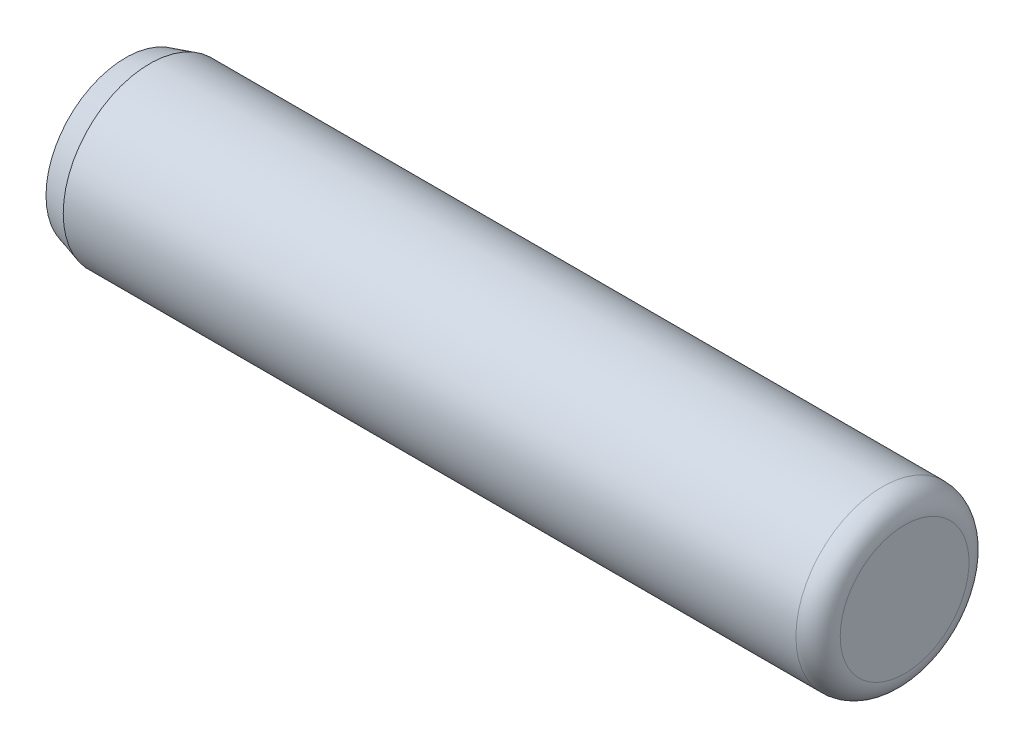
ISO-10303-21;
HEADER;
FILE_DESCRIPTION(('STEP AP214'),'2;1');
FILE_NAME('part.step','',(''),(''),'','','');
FILE_SCHEMA(('AUTOMOTIVE_DESIGN { 1 0 10303 214 1 1 1 1 }'));
ENDSEC;
DATA;
#1=APPLICATION_CONTEXT('core data for automotive mechanical design processes');
#2=APPLICATION_PROTOCOL_DEFINITION('international standard','automotive_design',2000,#1);
#3=PRODUCT_CONTEXT('',#1,'mechanical');
#4=PRODUCT('Part','Part','',(#3));
#5=PRODUCT_RELATED_PRODUCT_CATEGORY('part','',(#4));
#6=PRODUCT_DEFINITION_FORMATION('','',#4);
#7=PRODUCT_DEFINITION_CONTEXT('part definition',#1,'design');
#8=PRODUCT_DEFINITION('design','',#6,#7);
#9=PRODUCT_DEFINITION_SHAPE('','',#8);
#10=(LENGTH_UNIT() NAMED_UNIT(*) SI_UNIT(.MILLI.,.METRE.));
#11=(NAMED_UNIT(*) PLANE_ANGLE_UNIT() SI_UNIT($,.RADIAN.));
#12=(NAMED_UNIT(*) SI_UNIT($,.STERADIAN.) SOLID_ANGLE_UNIT());
#13=UNCERTAINTY_MEASURE_WITH_UNIT(LENGTH_MEASURE(1.E-05),#10,'distance_accuracy_value','');
#14=(GEOMETRIC_REPRESENTATION_CONTEXT(3) GLOBAL_UNCERTAINTY_ASSIGNED_CONTEXT((#13)) GLOBAL_UNIT_ASSIGNED_CONTEXT((#10,
#11,#12)) REPRESENTATION_CONTEXT('',''));
#15=CARTESIAN_POINT('',(0.,0.,0.));
#16=DIRECTION('',(0.,0.,1.));
#17=DIRECTION('',(1.,0.,0.));
#18=AXIS2_PLACEMENT_3D('',#15,#16,#17);
#19=CARTESIAN_POINT('',(6.73735,0.,0.));
#20=DIRECTION('',(-1.,0.,0.));
#21=DIRECTION('',(0.,0.,1.));
#22=AXIS2_PLACEMENT_3D('',#19,#20,#21);
#23=TOROIDAL_SURFACE('',#22,1.1811,0.406400000000001);
#24=CARTESIAN_POINT('',(6.73735,0.,0.));
#25=DIRECTION('',(-1.,0.,0.));
#26=DIRECTION('',(0.,0.,1.));
#27=AXIS2_PLACEMENT_3D('',#24,#25,#26);
#28=CIRCLE('',#27,1.5875);
#29=CARTESIAN_POINT('',(6.73735,0.,1.5875));
#30=VERTEX_POINT('',#29);
#31=EDGE_CURVE('E10',#30,#30,#28,.T.);
#32=ORIENTED_EDGE('',*,*,#31,.F.);
#33=EDGE_LOOP('',(#32));
#34=FACE_BOUND('',#33,.T.);
#35=CARTESIAN_POINT('',(7.14375,0.,0.));
#36=DIRECTION('',(-1.,0.,0.));
#37=DIRECTION('',(0.,0.,1.));
#38=AXIS2_PLACEMENT_3D('',#35,#36,#37);
#39=CIRCLE('',#38,1.1811);
#40=CARTESIAN_POINT('',(7.14375,0.,1.1811));
#41=VERTEX_POINT('',#40);
#42=EDGE_CURVE('E48',#41,#41,#39,.T.);
#43=ORIENTED_EDGE('',*,*,#42,.T.);
#44=EDGE_LOOP('',(#43));
#45=FACE_BOUND('',#44,.T.);
#46=ADVANCED_FACE('F34',(#34,#45),#23,.T.);
#47=CARTESIAN_POINT('',(-7.14375,0.,0.));
#48=DIRECTION('',(-1.,0.,0.));
#49=DIRECTION('',(0.,0.,1.));
#50=AXIS2_PLACEMENT_3D('',#47,#48,#49);
#51=CYLINDRICAL_SURFACE('',#50,1.5875);
#52=CARTESIAN_POINT('',(-6.70084836563221,0.,0.));
#53=DIRECTION('',(-1.,0.,0.));
#54=DIRECTION('',(0.,0.,1.));
#55=AXIS2_PLACEMENT_3D('',#52,#53,#54);
#56=CIRCLE('',#55,1.5875);
#57=CARTESIAN_POINT('',(-6.70084836563221,0.,1.5875));
#58=VERTEX_POINT('',#57);
#59=EDGE_CURVE('E40',#58,#58,#56,.T.);
#60=ORIENTED_EDGE('',*,*,#59,.F.);
#61=EDGE_LOOP('',(#60));
#62=FACE_BOUND('',#61,.T.);
#63=ORIENTED_EDGE('',*,*,#31,.T.);
#64=EDGE_LOOP('',(#63));
#65=FACE_BOUND('',#64,.T.);
#66=ADVANCED_FACE('F66',(#62,#65),#51,.T.);
#67=CARTESIAN_POINT('',(-6.70084836563221,0.,0.));
#68=DIRECTION('',(1.,0.,0.));
#69=DIRECTION('',(0.,0.,-1.));
#70=AXIS2_PLACEMENT_3D('',#67,#68,#69);
#71=CONICAL_SURFACE('',#70,1.5875,0.279252680319095);
#72=CARTESIAN_POINT('',(-7.14375,0.,0.));
#73=DIRECTION('',(-1.,0.,0.));
#74=DIRECTION('',(0.,0.,1.));
#75=AXIS2_PLACEMENT_3D('',#72,#73,#74);
#76=CIRCLE('',#75,1.4605);
#77=CARTESIAN_POINT('',(-7.14375,0.,1.4605));
#78=VERTEX_POINT('',#77);
#79=EDGE_CURVE('E44',#78,#78,#76,.T.);
#80=ORIENTED_EDGE('',*,*,#79,.F.);
#81=EDGE_LOOP('',(#80));
#82=FACE_BOUND('',#81,.T.);
#83=ORIENTED_EDGE('',*,*,#59,.T.);
#84=EDGE_LOOP('',(#83));
#85=FACE_BOUND('',#84,.T.);
#86=ADVANCED_FACE('F62',(#82,#85),#71,.T.);
#87=CARTESIAN_POINT('',(-7.14375,1.4605,0.));
#88=DIRECTION('',(1.,0.,0.));
#89=DIRECTION('',(0.,0.,-1.));
#90=AXIS2_PLACEMENT_3D('',#87,#88,#89);
#91=PLANE('',#90);
#92=ORIENTED_EDGE('',*,*,#79,.T.);
#93=EDGE_LOOP('',(#92));
#94=FACE_BOUND('',#93,.T.);
#95=ADVANCED_FACE('F57',(#94),#91,.F.);
#96=CARTESIAN_POINT('',(7.14375,1.1811,0.));
#97=DIRECTION('',(-1.,0.,0.));
#98=DIRECTION('',(0.,0.,1.));
#99=AXIS2_PLACEMENT_3D('',#96,#97,#98);
#100=PLANE('',#99);
#101=ORIENTED_EDGE('',*,*,#42,.F.);
#102=EDGE_LOOP('',(#101));
#103=FACE_BOUND('',#102,.T.);
#104=ADVANCED_FACE('F55',(#103),#100,.F.);
#105=CLOSED_SHELL('',(#46,#66,#86,#95,#104));
#106=MANIFOLD_SOLID_BREP('B2',#105);
#107=ADVANCED_BREP_SHAPE_REPRESENTATION('',(#18,#106),#14);
#108=SHAPE_DEFINITION_REPRESENTATION(#9,#107);
ENDSEC;
END-ISO-10303-21;
